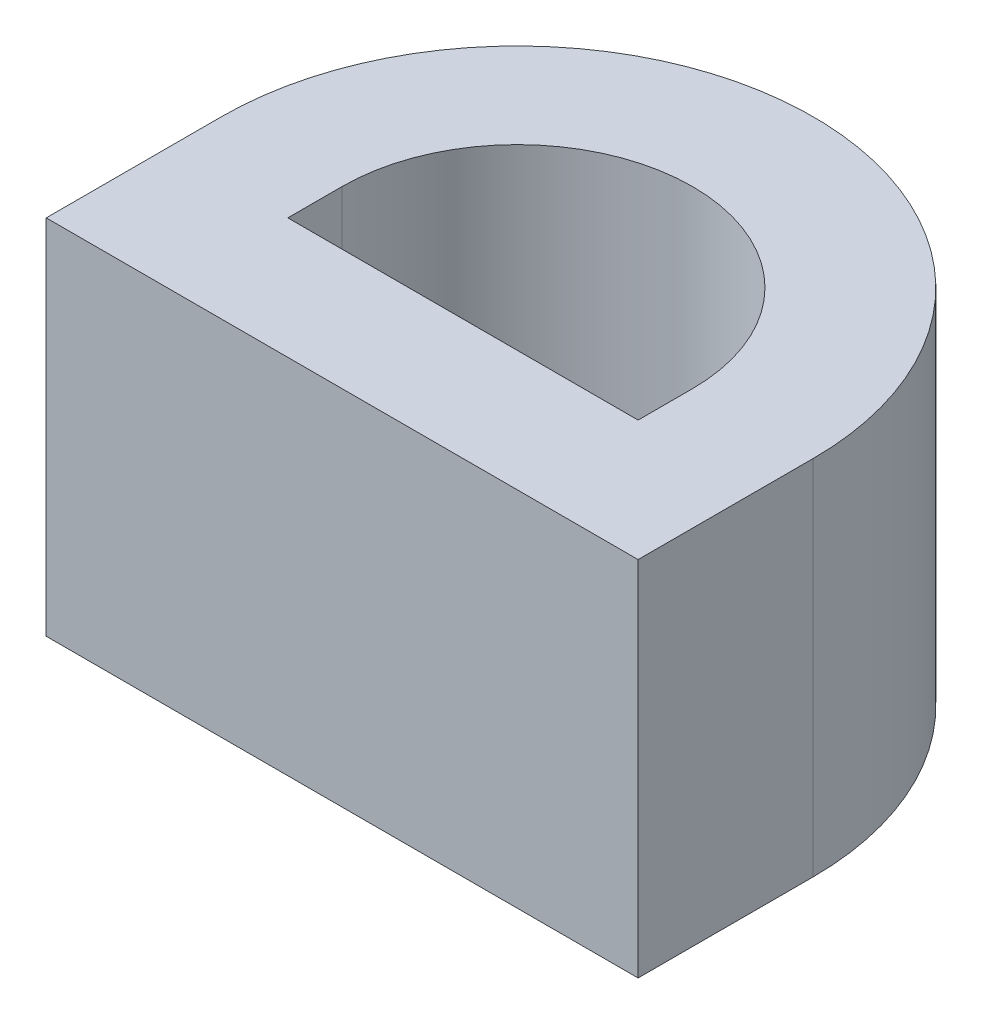
ISO-10303-21;
HEADER;
FILE_DESCRIPTION(('STEP AP214'),'2;1');
FILE_NAME('part.step','',(''),(''),'','','');
FILE_SCHEMA(('AUTOMOTIVE_DESIGN { 1 0 10303 214 1 1 1 1 }'));
ENDSEC;
DATA;
#1=APPLICATION_CONTEXT('core data for automotive mechanical design processes');
#2=APPLICATION_PROTOCOL_DEFINITION('international standard','automotive_design',2000,#1);
#3=PRODUCT_CONTEXT('',#1,'mechanical');
#4=PRODUCT('Part','Part','',(#3));
#5=PRODUCT_RELATED_PRODUCT_CATEGORY('part','',(#4));
#6=PRODUCT_DEFINITION_FORMATION('','',#4);
#7=PRODUCT_DEFINITION_CONTEXT('part definition',#1,'design');
#8=PRODUCT_DEFINITION('design','',#6,#7);
#9=PRODUCT_DEFINITION_SHAPE('','',#8);
#10=(LENGTH_UNIT() NAMED_UNIT(*) SI_UNIT(.MILLI.,.METRE.));
#11=(NAMED_UNIT(*) PLANE_ANGLE_UNIT() SI_UNIT($,.RADIAN.));
#12=(NAMED_UNIT(*) SI_UNIT($,.STERADIAN.) SOLID_ANGLE_UNIT());
#13=UNCERTAINTY_MEASURE_WITH_UNIT(LENGTH_MEASURE(1.E-05),#10,'distance_accuracy_value','');
#14=(GEOMETRIC_REPRESENTATION_CONTEXT(3) GLOBAL_UNCERTAINTY_ASSIGNED_CONTEXT((#13)) GLOBAL_UNIT_ASSIGNED_CONTEXT((#10,
#11,#12)) REPRESENTATION_CONTEXT('',''));
#15=CARTESIAN_POINT('',(0.,0.,0.));
#16=DIRECTION('',(0.,0.,1.));
#17=DIRECTION('',(1.,0.,0.));
#18=AXIS2_PLACEMENT_3D('',#15,#16,#17);
#19=CARTESIAN_POINT('',(0.,4.,2.9));
#20=DIRECTION('',(0.,0.,-1.));
#21=DIRECTION('',(-1.,0.,0.));
#22=AXIS2_PLACEMENT_3D('',#19,#20,#21);
#23=PLANE('',#22);
#24=DIRECTION('',(0.,-1.,0.));
#25=VECTOR('',#24,1.);
#26=CARTESIAN_POINT('',(-4.9,4.,2.9));
#27=LINE('',#26,#25);
#28=CARTESIAN_POINT('',(-4.9,4.,2.9));
#29=VERTEX_POINT('',#28);
#30=CARTESIAN_POINT('',(-4.9,-2.,2.9));
#31=VERTEX_POINT('',#30);
#32=EDGE_CURVE('E160',#29,#31,#27,.T.);
#33=ORIENTED_EDGE('',*,*,#32,.T.);
#34=DIRECTION('',(1.,0.,0.));
#35=VECTOR('',#34,1.);
#36=CARTESIAN_POINT('',(0.,-2.,2.9));
#37=LINE('',#36,#35);
#38=CARTESIAN_POINT('',(4.9,-2.,2.9));
#39=VERTEX_POINT('',#38);
#40=EDGE_CURVE('E204',#31,#39,#37,.T.);
#41=ORIENTED_EDGE('',*,*,#40,.T.);
#42=DIRECTION('',(0.,-1.,0.));
#43=VECTOR('',#42,1.);
#44=CARTESIAN_POINT('',(4.9,4.,2.9));
#45=LINE('',#44,#43);
#46=CARTESIAN_POINT('',(4.9,4.,2.9));
#47=VERTEX_POINT('',#46);
#48=EDGE_CURVE('E11',#47,#39,#45,.T.);
#49=ORIENTED_EDGE('',*,*,#48,.F.);
#50=DIRECTION('',(1.,0.,0.));
#51=VECTOR('',#50,1.);
#52=CARTESIAN_POINT('',(0.,4.,2.9));
#53=LINE('',#52,#51);
#54=EDGE_CURVE('E133',#29,#47,#53,.T.);
#55=ORIENTED_EDGE('',*,*,#54,.F.);
#56=EDGE_LOOP('',(#33,#41,#49,#55));
#57=FACE_BOUND('',#56,.T.);
#58=ADVANCED_FACE('F45',(#57),#23,.F.);
#59=CARTESIAN_POINT('',(4.9,4.,0.));
#60=DIRECTION('',(1.,0.,0.));
#61=DIRECTION('',(0.,0.,-1.));
#62=AXIS2_PLACEMENT_3D('',#59,#60,#61);
#63=PLANE('',#62);
#64=ORIENTED_EDGE('',*,*,#48,.T.);
#65=DIRECTION('',(0.,0.,1.));
#66=VECTOR('',#65,1.);
#67=CARTESIAN_POINT('',(4.9,-2.,0.));
#68=LINE('',#67,#66);
#69=CARTESIAN_POINT('',(4.9,-2.,0.));
#70=VERTEX_POINT('',#69);
#71=EDGE_CURVE('E118',#70,#39,#68,.T.);
#72=ORIENTED_EDGE('',*,*,#71,.F.);
#73=DIRECTION('',(0.,-1.,0.));
#74=VECTOR('',#73,1.);
#75=CARTESIAN_POINT('',(4.9,4.,0.));
#76=LINE('',#75,#74);
#77=CARTESIAN_POINT('',(4.9,4.,0.));
#78=VERTEX_POINT('',#77);
#79=EDGE_CURVE('E56',#78,#70,#76,.T.);
#80=ORIENTED_EDGE('',*,*,#79,.F.);
#81=DIRECTION('',(0.,0.,1.));
#82=VECTOR('',#81,1.);
#83=CARTESIAN_POINT('',(4.9,4.,0.));
#84=LINE('',#83,#82);
#85=EDGE_CURVE('E115',#78,#47,#84,.T.);
#86=ORIENTED_EDGE('',*,*,#85,.T.);
#87=EDGE_LOOP('',(#64,#72,#80,#86));
#88=FACE_BOUND('',#87,.T.);
#89=ADVANCED_FACE('F113',(#88),#63,.T.);
#90=CARTESIAN_POINT('',(0.,4.,0.));
#91=DIRECTION('',(0.,-1.,0.));
#92=DIRECTION('',(0.,0.,-1.));
#93=AXIS2_PLACEMENT_3D('',#90,#91,#92);
#94=CYLINDRICAL_SURFACE('',#93,4.9);
#95=ORIENTED_EDGE('',*,*,#79,.T.);
#96=CARTESIAN_POINT('',(0.,-2.,0.));
#97=DIRECTION('',(0.,1.,0.));
#98=DIRECTION('',(0.,0.,1.));
#99=AXIS2_PLACEMENT_3D('',#96,#97,#98);
#100=CIRCLE('',#99,4.9);
#101=CARTESIAN_POINT('',(-4.9,-2.,0.));
#102=VERTEX_POINT('',#101);
#103=EDGE_CURVE('E199',#70,#102,#100,.T.);
#104=ORIENTED_EDGE('',*,*,#103,.T.);
#105=DIRECTION('',(0.,-1.,0.));
#106=VECTOR('',#105,1.);
#107=CARTESIAN_POINT('',(-4.9,4.,0.));
#108=LINE('',#107,#106);
#109=CARTESIAN_POINT('',(-4.9,4.,0.));
#110=VERTEX_POINT('',#109);
#111=EDGE_CURVE('E123',#110,#102,#108,.T.);
#112=ORIENTED_EDGE('',*,*,#111,.F.);
#113=CARTESIAN_POINT('',(0.,4.,0.));
#114=DIRECTION('',(0.,1.,0.));
#115=DIRECTION('',(0.,0.,1.));
#116=AXIS2_PLACEMENT_3D('',#113,#114,#115);
#117=CIRCLE('',#116,4.9);
#118=EDGE_CURVE('E126',#78,#110,#117,.T.);
#119=ORIENTED_EDGE('',*,*,#118,.F.);
#120=EDGE_LOOP('',(#95,#104,#112,#119));
#121=FACE_BOUND('',#120,.T.);
#122=ADVANCED_FACE('F127',(#121),#94,.T.);
#123=CARTESIAN_POINT('',(2.9,4.,0.));
#124=DIRECTION('',(1.,0.,0.));
#125=DIRECTION('',(0.,0.,-1.));
#126=AXIS2_PLACEMENT_3D('',#123,#124,#125);
#127=PLANE('',#126);
#128=DIRECTION('',(0.,0.,1.));
#129=VECTOR('',#128,1.);
#130=CARTESIAN_POINT('',(2.9,0.,0.));
#131=LINE('',#130,#129);
#132=CARTESIAN_POINT('',(2.9,0.,0.));
#133=VERTEX_POINT('',#132);
#134=CARTESIAN_POINT('',(2.9,0.,0.9));
#135=VERTEX_POINT('',#134);
#136=EDGE_CURVE('E144',#133,#135,#131,.T.);
#137=ORIENTED_EDGE('',*,*,#136,.T.);
#138=DIRECTION('',(0.,-1.,0.));
#139=VECTOR('',#138,1.);
#140=CARTESIAN_POINT('',(2.9,4.,0.9));
#141=LINE('',#140,#139);
#142=CARTESIAN_POINT('',(2.9,4.,0.9));
#143=VERTEX_POINT('',#142);
#144=EDGE_CURVE('E49',#143,#135,#141,.T.);
#145=ORIENTED_EDGE('',*,*,#144,.F.);
#146=DIRECTION('',(0.,0.,1.));
#147=VECTOR('',#146,1.);
#148=CARTESIAN_POINT('',(2.9,4.,0.));
#149=LINE('',#148,#147);
#150=CARTESIAN_POINT('',(2.9,4.,0.));
#151=VERTEX_POINT('',#150);
#152=EDGE_CURVE('E95',#151,#143,#149,.T.);
#153=ORIENTED_EDGE('',*,*,#152,.F.);
#154=DIRECTION('',(0.,-1.,0.));
#155=VECTOR('',#154,1.);
#156=CARTESIAN_POINT('',(2.9,4.,0.));
#157=LINE('',#156,#155);
#158=EDGE_CURVE('E88',#151,#133,#157,.T.);
#159=ORIENTED_EDGE('',*,*,#158,.T.);
#160=EDGE_LOOP('',(#137,#145,#153,#159));
#161=FACE_BOUND('',#160,.T.);
#162=ADVANCED_FACE('F47',(#161),#127,.F.);
#163=CARTESIAN_POINT('',(0.,4.,0.9));
#164=DIRECTION('',(0.,0.,-1.));
#165=DIRECTION('',(-1.,0.,0.));
#166=AXIS2_PLACEMENT_3D('',#163,#164,#165);
#167=PLANE('',#166);
#168=DIRECTION('',(1.,0.,0.));
#169=VECTOR('',#168,1.);
#170=CARTESIAN_POINT('',(0.,0.,0.9));
#171=LINE('',#170,#169);
#172=CARTESIAN_POINT('',(-2.9,0.,0.9));
#173=VERTEX_POINT('',#172);
#174=EDGE_CURVE('E147',#173,#135,#171,.T.);
#175=ORIENTED_EDGE('',*,*,#174,.F.);
#176=DIRECTION('',(0.,-1.,0.));
#177=VECTOR('',#176,1.);
#178=CARTESIAN_POINT('',(-2.9,4.,0.9));
#179=LINE('',#178,#177);
#180=CARTESIAN_POINT('',(-2.9,4.,0.9));
#181=VERTEX_POINT('',#180);
#182=EDGE_CURVE('E169',#181,#173,#179,.T.);
#183=ORIENTED_EDGE('',*,*,#182,.F.);
#184=DIRECTION('',(1.,0.,0.));
#185=VECTOR('',#184,1.);
#186=CARTESIAN_POINT('',(0.,4.,0.9));
#187=LINE('',#186,#185);
#188=EDGE_CURVE('E179',#181,#143,#187,.T.);
#189=ORIENTED_EDGE('',*,*,#188,.T.);
#190=ORIENTED_EDGE('',*,*,#144,.T.);
#191=EDGE_LOOP('',(#175,#183,#189,#190));
#192=FACE_BOUND('',#191,.T.);
#193=ADVANCED_FACE('F178',(#192),#167,.T.);
#194=CARTESIAN_POINT('',(-2.9,4.,0.));
#195=DIRECTION('',(1.,0.,0.));
#196=DIRECTION('',(0.,0.,-1.));
#197=AXIS2_PLACEMENT_3D('',#194,#195,#196);
#198=PLANE('',#197);
#199=DIRECTION('',(0.,0.,1.));
#200=VECTOR('',#199,1.);
#201=CARTESIAN_POINT('',(-2.9,0.,0.));
#202=LINE('',#201,#200);
#203=CARTESIAN_POINT('',(-2.9,0.,0.));
#204=VERTEX_POINT('',#203);
#205=EDGE_CURVE('E152',#204,#173,#202,.T.);
#206=ORIENTED_EDGE('',*,*,#205,.F.);
#207=DIRECTION('',(0.,-1.,0.));
#208=VECTOR('',#207,1.);
#209=CARTESIAN_POINT('',(-2.9,4.,0.));
#210=LINE('',#209,#208);
#211=CARTESIAN_POINT('',(-2.9,4.,0.));
#212=VERTEX_POINT('',#211);
#213=EDGE_CURVE('E80',#212,#204,#210,.T.);
#214=ORIENTED_EDGE('',*,*,#213,.F.);
#215=DIRECTION('',(0.,0.,1.));
#216=VECTOR('',#215,1.);
#217=CARTESIAN_POINT('',(-2.9,4.,0.));
#218=LINE('',#217,#216);
#219=EDGE_CURVE('E186',#212,#181,#218,.T.);
#220=ORIENTED_EDGE('',*,*,#219,.T.);
#221=ORIENTED_EDGE('',*,*,#182,.T.);
#222=EDGE_LOOP('',(#206,#214,#220,#221));
#223=FACE_BOUND('',#222,.T.);
#224=ADVANCED_FACE('F184',(#223),#198,.T.);
#225=CARTESIAN_POINT('',(0.,4.,0.));
#226=DIRECTION('',(0.,-1.,0.));
#227=DIRECTION('',(0.,0.,-1.));
#228=AXIS2_PLACEMENT_3D('',#225,#226,#227);
#229=CYLINDRICAL_SURFACE('',#228,2.9);
#230=CARTESIAN_POINT('',(0.,0.,0.));
#231=DIRECTION('',(0.,1.,0.));
#232=DIRECTION('',(0.,0.,1.));
#233=AXIS2_PLACEMENT_3D('',#230,#231,#232);
#234=CIRCLE('',#233,2.9);
#235=EDGE_CURVE('E156',#133,#204,#234,.T.);
#236=ORIENTED_EDGE('',*,*,#235,.F.);
#237=ORIENTED_EDGE('',*,*,#158,.F.);
#238=CARTESIAN_POINT('',(0.,4.,0.));
#239=DIRECTION('',(0.,1.,0.));
#240=DIRECTION('',(0.,0.,1.));
#241=AXIS2_PLACEMENT_3D('',#238,#239,#240);
#242=CIRCLE('',#241,2.9);
#243=EDGE_CURVE('E138',#151,#212,#242,.T.);
#244=ORIENTED_EDGE('',*,*,#243,.T.);
#245=ORIENTED_EDGE('',*,*,#213,.T.);
#246=EDGE_LOOP('',(#236,#237,#244,#245));
#247=FACE_BOUND('',#246,.T.);
#248=ADVANCED_FACE('F189',(#247),#229,.F.);
#249=CARTESIAN_POINT('',(-4.9,4.,0.));
#250=DIRECTION('',(1.,0.,0.));
#251=DIRECTION('',(0.,0.,-1.));
#252=AXIS2_PLACEMENT_3D('',#249,#250,#251);
#253=PLANE('',#252);
#254=ORIENTED_EDGE('',*,*,#111,.T.);
#255=DIRECTION('',(0.,0.,1.));
#256=VECTOR('',#255,1.);
#257=CARTESIAN_POINT('',(-4.9,-2.,0.));
#258=LINE('',#257,#256);
#259=EDGE_CURVE('E148',#102,#31,#258,.T.);
#260=ORIENTED_EDGE('',*,*,#259,.T.);
#261=ORIENTED_EDGE('',*,*,#32,.F.);
#262=DIRECTION('',(0.,0.,1.));
#263=VECTOR('',#262,1.);
#264=CARTESIAN_POINT('',(-4.9,4.,0.));
#265=LINE('',#264,#263);
#266=EDGE_CURVE('E65',#110,#29,#265,.T.);
#267=ORIENTED_EDGE('',*,*,#266,.F.);
#268=EDGE_LOOP('',(#254,#260,#261,#267));
#269=FACE_BOUND('',#268,.T.);
#270=ADVANCED_FACE('F216',(#269),#253,.F.);
#271=CARTESIAN_POINT('',(0.,4.,0.));
#272=DIRECTION('',(0.,1.,0.));
#273=DIRECTION('',(0.,0.,1.));
#274=AXIS2_PLACEMENT_3D('',#271,#272,#273);
#275=PLANE('',#274);
#276=ORIENTED_EDGE('',*,*,#152,.T.);
#277=ORIENTED_EDGE('',*,*,#188,.F.);
#278=ORIENTED_EDGE('',*,*,#219,.F.);
#279=ORIENTED_EDGE('',*,*,#243,.F.);
#280=EDGE_LOOP('',(#276,#277,#278,#279));
#281=FACE_BOUND('',#280,.T.);
#282=ORIENTED_EDGE('',*,*,#54,.T.);
#283=ORIENTED_EDGE('',*,*,#85,.F.);
#284=ORIENTED_EDGE('',*,*,#118,.T.);
#285=ORIENTED_EDGE('',*,*,#266,.T.);
#286=EDGE_LOOP('',(#282,#283,#284,#285));
#287=FACE_BOUND('',#286,.T.);
#288=ADVANCED_FACE('F131',(#281,#287),#275,.T.);
#289=CARTESIAN_POINT('',(0.,0.,0.));
#290=DIRECTION('',(0.,1.,0.));
#291=DIRECTION('',(0.,0.,1.));
#292=AXIS2_PLACEMENT_3D('',#289,#290,#291);
#293=PLANE('',#292);
#294=ORIENTED_EDGE('',*,*,#136,.F.);
#295=ORIENTED_EDGE('',*,*,#235,.T.);
#296=ORIENTED_EDGE('',*,*,#205,.T.);
#297=ORIENTED_EDGE('',*,*,#174,.T.);
#298=EDGE_LOOP('',(#294,#295,#296,#297));
#299=FACE_BOUND('',#298,.T.);
#300=ADVANCED_FACE('F183',(#299),#293,.T.);
#301=CARTESIAN_POINT('',(0.,-2.,0.));
#302=DIRECTION('',(0.,1.,0.));
#303=DIRECTION('',(0.,0.,1.));
#304=AXIS2_PLACEMENT_3D('',#301,#302,#303);
#305=PLANE('',#304);
#306=ORIENTED_EDGE('',*,*,#40,.F.);
#307=ORIENTED_EDGE('',*,*,#259,.F.);
#308=ORIENTED_EDGE('',*,*,#103,.F.);
#309=ORIENTED_EDGE('',*,*,#71,.T.);
#310=EDGE_LOOP('',(#306,#307,#308,#309));
#311=FACE_BOUND('',#310,.T.);
#312=ADVANCED_FACE('F213',(#311),#305,.F.);
#313=CLOSED_SHELL('',(#58,#89,#122,#162,#193,#224,#248,#270,#288,#300,#312));
#314=MANIFOLD_SOLID_BREP('B2',#313);
#315=ADVANCED_BREP_SHAPE_REPRESENTATION('',(#18,#314),#14);
#316=SHAPE_DEFINITION_REPRESENTATION(#9,#315);
ENDSEC;
END-ISO-10303-21;
